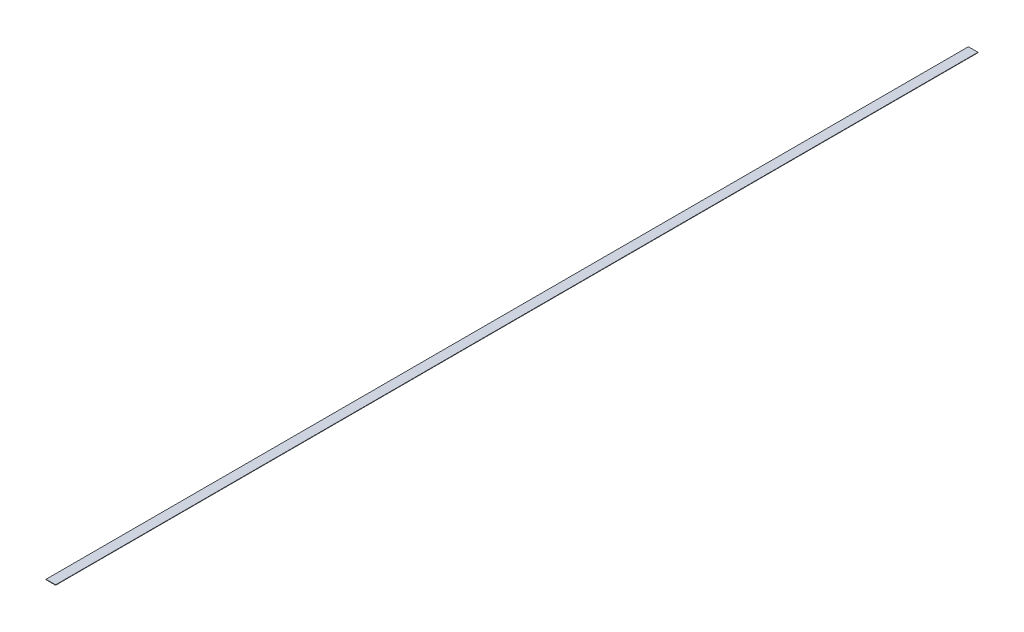
ISO-10303-21;
HEADER;
FILE_DESCRIPTION(('STEP AP214'),'2;1');
FILE_NAME('part.step','',(''),(''),'','','');
FILE_SCHEMA(('AUTOMOTIVE_DESIGN { 1 0 10303 214 1 1 1 1 }'));
ENDSEC;
DATA;
#1=APPLICATION_CONTEXT('core data for automotive mechanical design processes');
#2=APPLICATION_PROTOCOL_DEFINITION('international standard','automotive_design',2000,#1);
#3=PRODUCT_CONTEXT('',#1,'mechanical');
#4=PRODUCT('Part','Part','',(#3));
#5=PRODUCT_RELATED_PRODUCT_CATEGORY('part','',(#4));
#6=PRODUCT_DEFINITION_FORMATION('','',#4);
#7=PRODUCT_DEFINITION_CONTEXT('part definition',#1,'design');
#8=PRODUCT_DEFINITION('design','',#6,#7);
#9=PRODUCT_DEFINITION_SHAPE('','',#8);
#10=(LENGTH_UNIT() NAMED_UNIT(*) SI_UNIT(.MILLI.,.METRE.));
#11=(NAMED_UNIT(*) PLANE_ANGLE_UNIT() SI_UNIT($,.RADIAN.));
#12=(NAMED_UNIT(*) SI_UNIT($,.STERADIAN.) SOLID_ANGLE_UNIT());
#13=UNCERTAINTY_MEASURE_WITH_UNIT(LENGTH_MEASURE(1.E-05),#10,'distance_accuracy_value','');
#14=(GEOMETRIC_REPRESENTATION_CONTEXT(3) GLOBAL_UNCERTAINTY_ASSIGNED_CONTEXT((#13)) GLOBAL_UNIT_ASSIGNED_CONTEXT((#10,
#11,#12)) REPRESENTATION_CONTEXT('',''));
#15=CARTESIAN_POINT('',(0.,0.,0.));
#16=DIRECTION('',(0.,0.,1.));
#17=DIRECTION('',(1.,0.,0.));
#18=AXIS2_PLACEMENT_3D('',#15,#16,#17);
#19=CARTESIAN_POINT('',(-9.52499999999981,0.79375,-914.4));
#20=DIRECTION('',(1.,0.,0.));
#21=DIRECTION('',(0.,0.,-1.));
#22=AXIS2_PLACEMENT_3D('',#19,#20,#21);
#23=PLANE('',#22);
#24=DIRECTION('',(0.,0.,-1.));
#25=VECTOR('',#24,1.);
#26=CARTESIAN_POINT('',(-9.52499999999981,0.,-914.4));
#27=LINE('',#26,#25);
#28=CARTESIAN_POINT('',(-9.52499999999981,0.,-914.4));
#29=VERTEX_POINT('',#28);
#30=CARTESIAN_POINT('',(-9.52499999999981,0.,914.4));
#31=VERTEX_POINT('',#30);
#32=EDGE_CURVE('E96',#29,#31,#27,.F.);
#33=ORIENTED_EDGE('',*,*,#32,.T.);
#34=DIRECTION('',(0.,-1.,0.));
#35=VECTOR('',#34,1.);
#36=CARTESIAN_POINT('',(-9.52499999999981,0.79375,914.4));
#37=LINE('',#36,#35);
#38=CARTESIAN_POINT('',(-9.52499999999981,0.79375,914.4));
#39=VERTEX_POINT('',#38);
#40=EDGE_CURVE('E11',#39,#31,#37,.T.);
#41=ORIENTED_EDGE('',*,*,#40,.F.);
#42=DIRECTION('',(0.,0.,-1.));
#43=VECTOR('',#42,1.);
#44=CARTESIAN_POINT('',(-9.52499999999981,0.79375,-914.4));
#45=LINE('',#44,#43);
#46=CARTESIAN_POINT('',(-9.52499999999981,0.79375,-914.4));
#47=VERTEX_POINT('',#46);
#48=EDGE_CURVE('E73',#47,#39,#45,.F.);
#49=ORIENTED_EDGE('',*,*,#48,.F.);
#50=DIRECTION('',(0.,-1.,0.));
#51=VECTOR('',#50,1.);
#52=CARTESIAN_POINT('',(-9.52499999999981,0.79375,-914.4));
#53=LINE('',#52,#51);
#54=EDGE_CURVE('E49',#47,#29,#53,.T.);
#55=ORIENTED_EDGE('',*,*,#54,.T.);
#56=EDGE_LOOP('',(#33,#41,#49,#55));
#57=FACE_BOUND('',#56,.T.);
#58=ADVANCED_FACE('F33',(#57),#23,.F.);
#59=CARTESIAN_POINT('',(9.52500000000019,0.79375,914.4));
#60=DIRECTION('',(0.,0.,1.));
#61=DIRECTION('',(1.,0.,0.));
#62=AXIS2_PLACEMENT_3D('',#59,#60,#61);
#63=PLANE('',#62);
#64=DIRECTION('',(-1.,0.,0.));
#65=VECTOR('',#64,1.);
#66=CARTESIAN_POINT('',(9.52500000000019,0.,914.4));
#67=LINE('',#66,#65);
#68=CARTESIAN_POINT('',(9.52500000000019,0.,914.4));
#69=VERTEX_POINT('',#68);
#70=EDGE_CURVE('E82',#69,#31,#67,.T.);
#71=ORIENTED_EDGE('',*,*,#70,.F.);
#72=DIRECTION('',(0.,-1.,0.));
#73=VECTOR('',#72,1.);
#74=CARTESIAN_POINT('',(9.52500000000019,0.79375,914.4));
#75=LINE('',#74,#73);
#76=CARTESIAN_POINT('',(9.52500000000019,0.79375,914.4));
#77=VERTEX_POINT('',#76);
#78=EDGE_CURVE('E41',#77,#69,#75,.T.);
#79=ORIENTED_EDGE('',*,*,#78,.F.);
#80=DIRECTION('',(-1.,0.,0.));
#81=VECTOR('',#80,1.);
#82=CARTESIAN_POINT('',(9.52500000000019,0.79375,914.4));
#83=LINE('',#82,#81);
#84=EDGE_CURVE('E80',#77,#39,#83,.T.);
#85=ORIENTED_EDGE('',*,*,#84,.T.);
#86=ORIENTED_EDGE('',*,*,#40,.T.);
#87=EDGE_LOOP('',(#71,#79,#85,#86));
#88=FACE_BOUND('',#87,.T.);
#89=ADVANCED_FACE('F79',(#88),#63,.T.);
#90=CARTESIAN_POINT('',(9.52500000000019,0.79375,-914.4));
#91=DIRECTION('',(1.,0.,0.));
#92=DIRECTION('',(0.,0.,-1.));
#93=AXIS2_PLACEMENT_3D('',#90,#91,#92);
#94=PLANE('',#93);
#95=DIRECTION('',(0.,0.,-1.));
#96=VECTOR('',#95,1.);
#97=CARTESIAN_POINT('',(9.52500000000019,0.,-914.4));
#98=LINE('',#97,#96);
#99=CARTESIAN_POINT('',(9.52500000000019,0.,-914.4));
#100=VERTEX_POINT('',#99);
#101=EDGE_CURVE('E99',#100,#69,#98,.F.);
#102=ORIENTED_EDGE('',*,*,#101,.F.);
#103=DIRECTION('',(0.,-1.,0.));
#104=VECTOR('',#103,1.);
#105=CARTESIAN_POINT('',(9.52500000000019,0.79375,-914.4));
#106=LINE('',#105,#104);
#107=CARTESIAN_POINT('',(9.52500000000019,0.79375,-914.4));
#108=VERTEX_POINT('',#107);
#109=EDGE_CURVE('E62',#108,#100,#106,.T.);
#110=ORIENTED_EDGE('',*,*,#109,.F.);
#111=DIRECTION('',(0.,0.,-1.));
#112=VECTOR('',#111,1.);
#113=CARTESIAN_POINT('',(9.52500000000019,0.79375,-914.4));
#114=LINE('',#113,#112);
#115=EDGE_CURVE('E88',#108,#77,#114,.F.);
#116=ORIENTED_EDGE('',*,*,#115,.T.);
#117=ORIENTED_EDGE('',*,*,#78,.T.);
#118=EDGE_LOOP('',(#102,#110,#116,#117));
#119=FACE_BOUND('',#118,.T.);
#120=ADVANCED_FACE('F90',(#119),#94,.T.);
#121=CARTESIAN_POINT('',(-9.52499999999981,0.79375,-914.4));
#122=DIRECTION('',(0.,0.,-1.));
#123=DIRECTION('',(-1.,0.,0.));
#124=AXIS2_PLACEMENT_3D('',#121,#122,#123);
#125=PLANE('',#124);
#126=DIRECTION('',(1.,0.,0.));
#127=VECTOR('',#126,1.);
#128=CARTESIAN_POINT('',(-9.52499999999981,0.,-914.4));
#129=LINE('',#128,#127);
#130=EDGE_CURVE('E101',#29,#100,#129,.T.);
#131=ORIENTED_EDGE('',*,*,#130,.F.);
#132=ORIENTED_EDGE('',*,*,#54,.F.);
#133=DIRECTION('',(1.,0.,0.));
#134=VECTOR('',#133,1.);
#135=CARTESIAN_POINT('',(-9.52499999999981,0.79375,-914.4));
#136=LINE('',#135,#134);
#137=EDGE_CURVE('E91',#47,#108,#136,.T.);
#138=ORIENTED_EDGE('',*,*,#137,.T.);
#139=ORIENTED_EDGE('',*,*,#109,.T.);
#140=EDGE_LOOP('',(#131,#132,#138,#139));
#141=FACE_BOUND('',#140,.T.);
#142=ADVANCED_FACE('F107',(#141),#125,.T.);
#143=CARTESIAN_POINT('',(-9.52499999999981,0.79375,914.4));
#144=DIRECTION('',(0.,1.,0.));
#145=DIRECTION('',(0.,0.,1.));
#146=AXIS2_PLACEMENT_3D('',#143,#144,#145);
#147=PLANE('',#146);
#148=ORIENTED_EDGE('',*,*,#48,.T.);
#149=ORIENTED_EDGE('',*,*,#84,.F.);
#150=ORIENTED_EDGE('',*,*,#115,.F.);
#151=ORIENTED_EDGE('',*,*,#137,.F.);
#152=EDGE_LOOP('',(#148,#149,#150,#151));
#153=FACE_BOUND('',#152,.T.);
#154=ADVANCED_FACE('F87',(#153),#147,.T.);
#155=CARTESIAN_POINT('',(-9.52499999999981,0.,914.4));
#156=DIRECTION('',(0.,1.,0.));
#157=DIRECTION('',(0.,0.,1.));
#158=AXIS2_PLACEMENT_3D('',#155,#156,#157);
#159=PLANE('',#158);
#160=ORIENTED_EDGE('',*,*,#32,.F.);
#161=ORIENTED_EDGE('',*,*,#130,.T.);
#162=ORIENTED_EDGE('',*,*,#101,.T.);
#163=ORIENTED_EDGE('',*,*,#70,.T.);
#164=EDGE_LOOP('',(#160,#161,#162,#163));
#165=FACE_BOUND('',#164,.T.);
#166=ADVANCED_FACE('F106',(#165),#159,.F.);
#167=CLOSED_SHELL('',(#58,#89,#120,#142,#154,#166));
#168=MANIFOLD_SOLID_BREP('B2',#167);
#169=ADVANCED_BREP_SHAPE_REPRESENTATION('',(#18,#168),#14);
#170=SHAPE_DEFINITION_REPRESENTATION(#9,#169);
ENDSEC;
END-ISO-10303-21;
